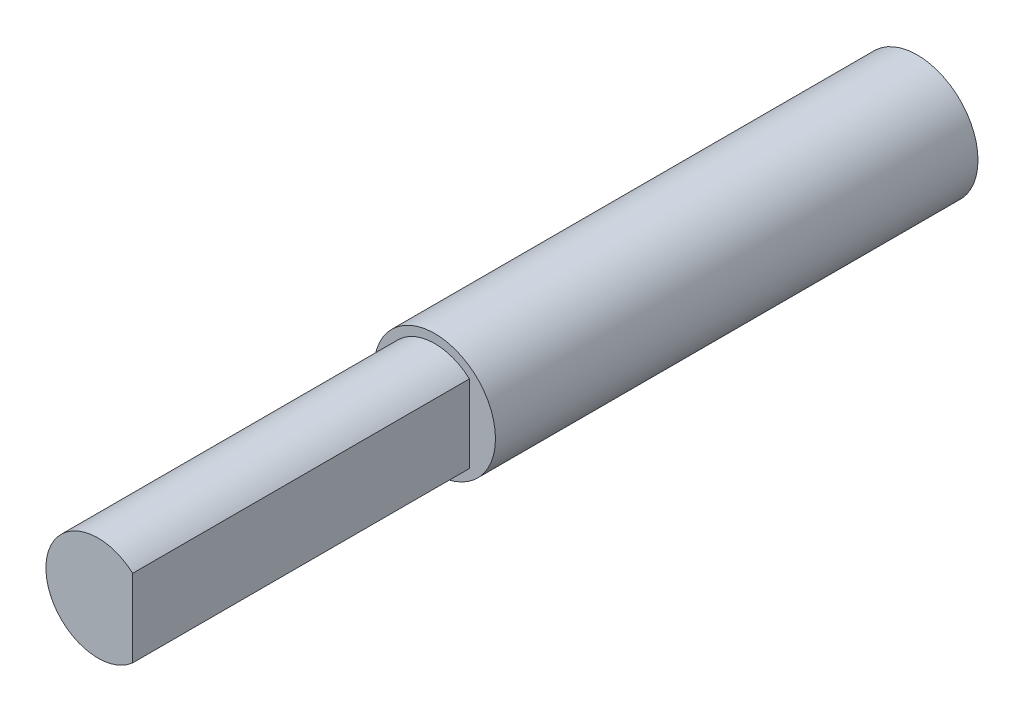
ISO-10303-21;
HEADER;
FILE_DESCRIPTION(('STEP AP214'),'2;1');
FILE_NAME('part.step','',(''),(''),'','','');
FILE_SCHEMA(('AUTOMOTIVE_DESIGN { 1 0 10303 214 1 1 1 1 }'));
ENDSEC;
DATA;
#1=APPLICATION_CONTEXT('core data for automotive mechanical design processes');
#2=APPLICATION_PROTOCOL_DEFINITION('international standard','automotive_design',2000,#1);
#3=PRODUCT_CONTEXT('',#1,'mechanical');
#4=PRODUCT('Part','Part','',(#3));
#5=PRODUCT_RELATED_PRODUCT_CATEGORY('part','',(#4));
#6=PRODUCT_DEFINITION_FORMATION('','',#4);
#7=PRODUCT_DEFINITION_CONTEXT('part definition',#1,'design');
#8=PRODUCT_DEFINITION('design','',#6,#7);
#9=PRODUCT_DEFINITION_SHAPE('','',#8);
#10=(LENGTH_UNIT() NAMED_UNIT(*) SI_UNIT(.MILLI.,.METRE.));
#11=(NAMED_UNIT(*) PLANE_ANGLE_UNIT() SI_UNIT($,.RADIAN.));
#12=(NAMED_UNIT(*) SI_UNIT($,.STERADIAN.) SOLID_ANGLE_UNIT());
#13=UNCERTAINTY_MEASURE_WITH_UNIT(LENGTH_MEASURE(1.E-05),#10,'distance_accuracy_value','');
#14=(GEOMETRIC_REPRESENTATION_CONTEXT(3) GLOBAL_UNCERTAINTY_ASSIGNED_CONTEXT((#13)) GLOBAL_UNIT_ASSIGNED_CONTEXT((#10,
#11,#12)) REPRESENTATION_CONTEXT('',''));
#15=CARTESIAN_POINT('',(0.,0.,0.));
#16=DIRECTION('',(0.,0.,1.));
#17=DIRECTION('',(1.,0.,0.));
#18=AXIS2_PLACEMENT_3D('',#15,#16,#17);
#19=CARTESIAN_POINT('',(0.,0.,13.9));
#20=DIRECTION('',(0.,0.,1.));
#21=DIRECTION('',(1.,0.,0.));
#22=AXIS2_PLACEMENT_3D('',#19,#20,#21);
#23=PLANE('',#22);
#24=CARTESIAN_POINT('',(0.,0.,13.9));
#25=DIRECTION('',(0.,0.,1.));
#26=DIRECTION('',(1.,0.,0.));
#27=AXIS2_PLACEMENT_3D('',#24,#25,#26);
#28=CIRCLE('',#27,1.75);
#29=CARTESIAN_POINT('',(1.75,0.,13.9));
#30=VERTEX_POINT('',#29);
#31=EDGE_CURVE('E11',#30,#30,#28,.T.);
#32=ORIENTED_EDGE('',*,*,#31,.T.);
#33=EDGE_LOOP('',(#32));
#34=FACE_BOUND('',#33,.T.);
#35=CARTESIAN_POINT('',(0.,0.,13.9));
#36=DIRECTION('',(0.,0.,1.));
#37=DIRECTION('',(1.,0.,0.));
#38=AXIS2_PLACEMENT_3D('',#35,#36,#37);
#39=CIRCLE('',#38,1.5);
#40=CARTESIAN_POINT('',(1.,1.11803398874989,13.9));
#41=VERTEX_POINT('',#40);
#42=CARTESIAN_POINT('',(1.,-1.11803398874989,13.9));
#43=VERTEX_POINT('',#42);
#44=EDGE_CURVE('E54',#41,#43,#39,.T.);
#45=ORIENTED_EDGE('',*,*,#44,.F.);
#46=DIRECTION('',(0.,-1.,0.));
#47=VECTOR('',#46,1.);
#48=CARTESIAN_POINT('',(1.,0.,13.9));
#49=LINE('',#48,#47);
#50=EDGE_CURVE('E68',#41,#43,#49,.T.);
#51=ORIENTED_EDGE('',*,*,#50,.T.);
#52=EDGE_LOOP('',(#45,#51));
#53=FACE_BOUND('',#52,.T.);
#54=ADVANCED_FACE('F39',(#34,#53),#23,.T.);
#55=CARTESIAN_POINT('',(0.,0.,13.9));
#56=DIRECTION('',(0.,0.,-1.));
#57=DIRECTION('',(-1.,0.,0.));
#58=AXIS2_PLACEMENT_3D('',#55,#56,#57);
#59=CYLINDRICAL_SURFACE('',#58,1.75);
#60=ORIENTED_EDGE('',*,*,#31,.F.);
#61=EDGE_LOOP('',(#60));
#62=FACE_BOUND('',#61,.T.);
#63=CARTESIAN_POINT('',(0.,0.,0.));
#64=DIRECTION('',(0.,0.,1.));
#65=DIRECTION('',(1.,0.,0.));
#66=AXIS2_PLACEMENT_3D('',#63,#64,#65);
#67=CIRCLE('',#66,1.75);
#68=CARTESIAN_POINT('',(1.75,0.,0.));
#69=VERTEX_POINT('',#68);
#70=EDGE_CURVE('E43',#69,#69,#67,.T.);
#71=ORIENTED_EDGE('',*,*,#70,.T.);
#72=EDGE_LOOP('',(#71));
#73=FACE_BOUND('',#72,.T.);
#74=ADVANCED_FACE('F41',(#62,#73),#59,.T.);
#75=CARTESIAN_POINT('',(0.,0.,0.));
#76=DIRECTION('',(0.,0.,1.));
#77=DIRECTION('',(1.,0.,0.));
#78=AXIS2_PLACEMENT_3D('',#75,#76,#77);
#79=PLANE('',#78);
#80=ORIENTED_EDGE('',*,*,#70,.F.);
#81=EDGE_LOOP('',(#80));
#82=FACE_BOUND('',#81,.T.);
#83=ADVANCED_FACE('F94',(#82),#79,.F.);
#84=CARTESIAN_POINT('',(1.,0.,23.6));
#85=DIRECTION('',(1.,0.,0.));
#86=DIRECTION('',(0.,0.,-1.));
#87=AXIS2_PLACEMENT_3D('',#84,#85,#86);
#88=PLANE('',#87);
#89=ORIENTED_EDGE('',*,*,#50,.F.);
#90=DIRECTION('',(0.,0.,-1.));
#91=VECTOR('',#90,1.);
#92=CARTESIAN_POINT('',(1.,1.11803398874989,23.6));
#93=LINE('',#92,#91);
#94=CARTESIAN_POINT('',(1.,1.11803398874989,23.6));
#95=VERTEX_POINT('',#94);
#96=EDGE_CURVE('E79',#95,#41,#93,.T.);
#97=ORIENTED_EDGE('',*,*,#96,.F.);
#98=DIRECTION('',(0.,-1.,0.));
#99=VECTOR('',#98,1.);
#100=CARTESIAN_POINT('',(1.,0.,23.6));
#101=LINE('',#100,#99);
#102=CARTESIAN_POINT('',(1.,-1.11803398874989,23.6));
#103=VERTEX_POINT('',#102);
#104=EDGE_CURVE('E76',#95,#103,#101,.T.);
#105=ORIENTED_EDGE('',*,*,#104,.T.);
#106=DIRECTION('',(0.,0.,-1.));
#107=VECTOR('',#106,1.);
#108=CARTESIAN_POINT('',(1.,-1.11803398874989,23.6));
#109=LINE('',#108,#107);
#110=EDGE_CURVE('E74',#103,#43,#109,.T.);
#111=ORIENTED_EDGE('',*,*,#110,.T.);
#112=EDGE_LOOP('',(#89,#97,#105,#111));
#113=FACE_BOUND('',#112,.T.);
#114=ADVANCED_FACE('F75',(#113),#88,.T.);
#115=CARTESIAN_POINT('',(0.,0.,23.6));
#116=DIRECTION('',(0.,0.,-1.));
#117=DIRECTION('',(-1.,0.,0.));
#118=AXIS2_PLACEMENT_3D('',#115,#116,#117);
#119=CYLINDRICAL_SURFACE('',#118,1.5);
#120=ORIENTED_EDGE('',*,*,#44,.T.);
#121=ORIENTED_EDGE('',*,*,#110,.F.);
#122=CARTESIAN_POINT('',(0.,0.,23.6));
#123=DIRECTION('',(0.,0.,1.));
#124=DIRECTION('',(1.,0.,0.));
#125=AXIS2_PLACEMENT_3D('',#122,#123,#124);
#126=CIRCLE('',#125,1.5);
#127=EDGE_CURVE('E62',#95,#103,#126,.T.);
#128=ORIENTED_EDGE('',*,*,#127,.F.);
#129=ORIENTED_EDGE('',*,*,#96,.T.);
#130=EDGE_LOOP('',(#120,#121,#128,#129));
#131=FACE_BOUND('',#130,.T.);
#132=ADVANCED_FACE('F81',(#131),#119,.T.);
#133=CARTESIAN_POINT('',(0.,0.,23.6));
#134=DIRECTION('',(0.,0.,1.));
#135=DIRECTION('',(1.,0.,0.));
#136=AXIS2_PLACEMENT_3D('',#133,#134,#135);
#137=PLANE('',#136);
#138=ORIENTED_EDGE('',*,*,#104,.F.);
#139=ORIENTED_EDGE('',*,*,#127,.T.);
#140=EDGE_LOOP('',(#138,#139));
#141=FACE_BOUND('',#140,.T.);
#142=ADVANCED_FACE('F110',(#141),#137,.T.);
#143=CLOSED_SHELL('',(#54,#74,#83,#114,#132,#142));
#144=MANIFOLD_SOLID_BREP('B2',#143);
#145=ADVANCED_BREP_SHAPE_REPRESENTATION('',(#18,#144),#14);
#146=SHAPE_DEFINITION_REPRESENTATION(#9,#145);
ENDSEC;
END-ISO-10303-21;
